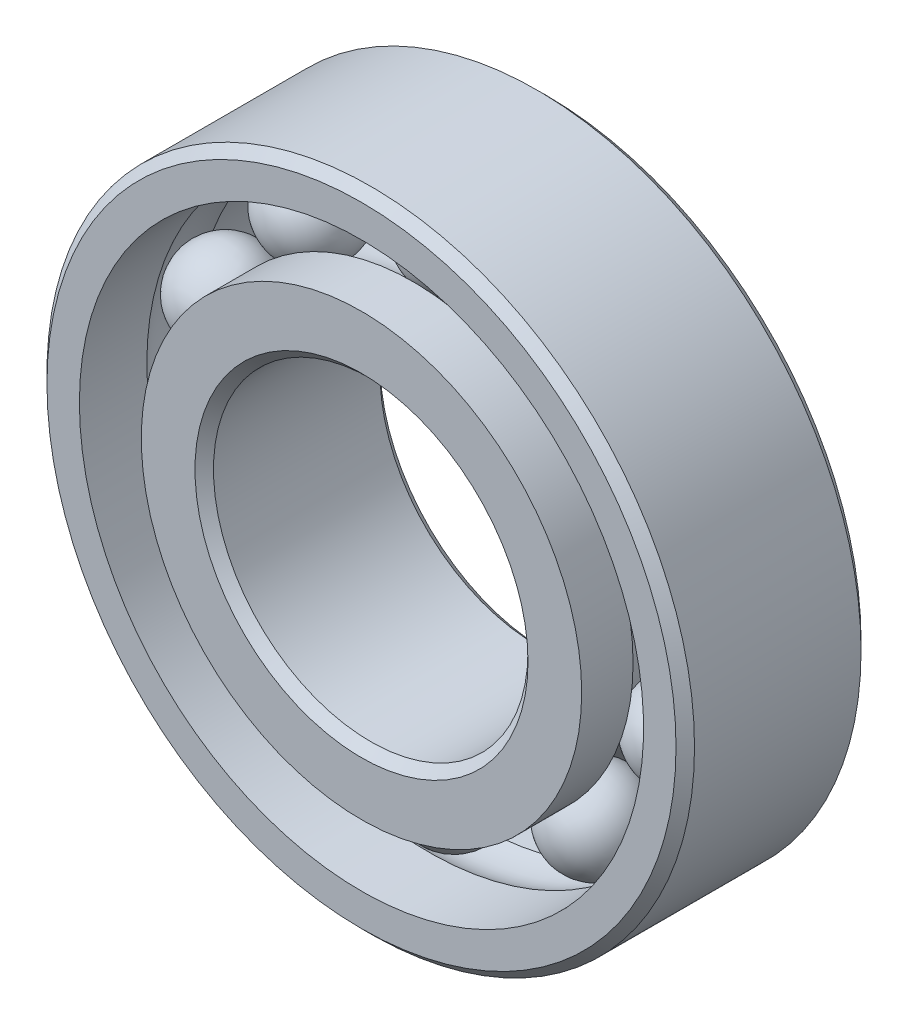
ISO-10303-21;
HEADER;
FILE_DESCRIPTION(('STEP AP214'),'2;1');
FILE_NAME('part.step','',(''),(''),'','','');
FILE_SCHEMA(('AUTOMOTIVE_DESIGN { 1 0 10303 214 1 1 1 1 }'));
ENDSEC;
DATA;
#1=APPLICATION_CONTEXT('core data for automotive mechanical design processes');
#2=APPLICATION_PROTOCOL_DEFINITION('international standard','automotive_design',2000,#1);
#3=PRODUCT_CONTEXT('',#1,'mechanical');
#4=PRODUCT('Part','Part','',(#3));
#5=PRODUCT_RELATED_PRODUCT_CATEGORY('part','',(#4));
#6=PRODUCT_DEFINITION_FORMATION('','',#4);
#7=PRODUCT_DEFINITION_CONTEXT('part definition',#1,'design');
#8=PRODUCT_DEFINITION('design','',#6,#7);
#9=PRODUCT_DEFINITION_SHAPE('','',#8);
#10=(LENGTH_UNIT() NAMED_UNIT(*) SI_UNIT(.MILLI.,.METRE.));
#11=(NAMED_UNIT(*) PLANE_ANGLE_UNIT() SI_UNIT($,.RADIAN.));
#12=(NAMED_UNIT(*) SI_UNIT($,.STERADIAN.) SOLID_ANGLE_UNIT());
#13=UNCERTAINTY_MEASURE_WITH_UNIT(LENGTH_MEASURE(1.E-05),#10,'distance_accuracy_value','');
#14=(GEOMETRIC_REPRESENTATION_CONTEXT(3) GLOBAL_UNCERTAINTY_ASSIGNED_CONTEXT((#13)) GLOBAL_UNIT_ASSIGNED_CONTEXT((#10,
#11,#12)) REPRESENTATION_CONTEXT('',''));
#15=CARTESIAN_POINT('',(0.,0.,0.));
#16=DIRECTION('',(0.,0.,1.));
#17=DIRECTION('',(1.,0.,0.));
#18=AXIS2_PLACEMENT_3D('',#15,#16,#17);
#19=CARTESIAN_POINT('',(0.,17.,-5.00000000000001));
#20=DIRECTION('',(0.,0.,-1.));
#21=DIRECTION('',(-1.,0.,0.));
#22=AXIS2_PLACEMENT_3D('',#19,#20,#21);
#23=PLANE('',#22);
#24=CARTESIAN_POINT('',(0.,0.,-5.00000000000001));
#25=DIRECTION('',(0.,0.,-1.));
#26=DIRECTION('',(-1.,0.,0.));
#27=AXIS2_PLACEMENT_3D('',#24,#25,#26);
#28=CIRCLE('',#27,17.);
#29=CARTESIAN_POINT('',(-17.,0.,-5.00000000000001));
#30=VERTEX_POINT('',#29);
#31=EDGE_CURVE('E11',#30,#30,#28,.T.);
#32=ORIENTED_EDGE('',*,*,#31,.T.);
#33=EDGE_LOOP('',(#32));
#34=FACE_BOUND('',#33,.T.);
#35=CARTESIAN_POINT('',(0.,0.,-5.00000000000001));
#36=DIRECTION('',(0.,0.,-1.));
#37=DIRECTION('',(-1.,0.,0.));
#38=AXIS2_PLACEMENT_3D('',#35,#36,#37);
#39=CIRCLE('',#38,15.2468828709565);
#40=CARTESIAN_POINT('',(-15.2468828709565,0.,-5.00000000000001));
#41=VERTEX_POINT('',#40);
#42=EDGE_CURVE('E61',#41,#41,#39,.T.);
#43=ORIENTED_EDGE('',*,*,#42,.F.);
#44=EDGE_LOOP('',(#43));
#45=FACE_BOUND('',#44,.T.);
#46=ADVANCED_FACE('F39',(#34,#45),#23,.T.);
#47=CARTESIAN_POINT('',(0.,0.,-5.00000000000001));
#48=DIRECTION('',(0.,0.,-1.));
#49=DIRECTION('',(-1.,0.,0.));
#50=AXIS2_PLACEMENT_3D('',#47,#48,#49);
#51=CYLINDRICAL_SURFACE('',#50,17.);
#52=CARTESIAN_POINT('',(0.,0.,5.));
#53=DIRECTION('',(0.,0.,-1.));
#54=DIRECTION('',(-1.,0.,0.));
#55=AXIS2_PLACEMENT_3D('',#52,#53,#54);
#56=CIRCLE('',#55,17.);
#57=CARTESIAN_POINT('',(-17.,0.,5.));
#58=VERTEX_POINT('',#57);
#59=EDGE_CURVE('E45',#58,#58,#56,.T.);
#60=ORIENTED_EDGE('',*,*,#59,.T.);
#61=EDGE_LOOP('',(#60));
#62=FACE_BOUND('',#61,.T.);
#63=ORIENTED_EDGE('',*,*,#31,.F.);
#64=EDGE_LOOP('',(#63));
#65=FACE_BOUND('',#64,.T.);
#66=ADVANCED_FACE('F69',(#62,#65),#51,.T.);
#67=CARTESIAN_POINT('',(0.,17.,5.));
#68=DIRECTION('',(0.,0.,1.));
#69=DIRECTION('',(1.,0.,0.));
#70=AXIS2_PLACEMENT_3D('',#67,#68,#69);
#71=PLANE('',#70);
#72=CARTESIAN_POINT('',(0.,0.,5.));
#73=DIRECTION('',(0.,0.,-1.));
#74=DIRECTION('',(-1.,0.,0.));
#75=AXIS2_PLACEMENT_3D('',#72,#73,#74);
#76=CIRCLE('',#75,15.2468828709565);
#77=CARTESIAN_POINT('',(-15.2468828709565,0.,5.));
#78=VERTEX_POINT('',#77);
#79=EDGE_CURVE('E49',#78,#78,#76,.T.);
#80=ORIENTED_EDGE('',*,*,#79,.T.);
#81=EDGE_LOOP('',(#80));
#82=FACE_BOUND('',#81,.T.);
#83=ORIENTED_EDGE('',*,*,#59,.F.);
#84=EDGE_LOOP('',(#83));
#85=FACE_BOUND('',#84,.T.);
#86=ADVANCED_FACE('F73',(#82,#85),#71,.T.);
#87=CARTESIAN_POINT('',(0.,0.,-5.00000000000001));
#88=DIRECTION('',(0.,0.,-1.));
#89=DIRECTION('',(-1.,0.,0.));
#90=AXIS2_PLACEMENT_3D('',#87,#88,#89);
#91=CYLINDRICAL_SURFACE('',#90,15.2468828709565);
#92=CARTESIAN_POINT('',(0.,0.,1.35620686104391));
#93=DIRECTION('',(0.,0.,-1.));
#94=DIRECTION('',(-1.,0.,0.));
#95=AXIS2_PLACEMENT_3D('',#92,#93,#94);
#96=CIRCLE('',#95,15.2468828709565);
#97=CARTESIAN_POINT('',(-15.2468828709565,0.,1.35620686104391));
#98=VERTEX_POINT('',#97);
#99=EDGE_CURVE('E53',#98,#98,#96,.T.);
#100=ORIENTED_EDGE('',*,*,#99,.T.);
#101=EDGE_LOOP('',(#100));
#102=FACE_BOUND('',#101,.T.);
#103=ORIENTED_EDGE('',*,*,#79,.F.);
#104=EDGE_LOOP('',(#103));
#105=FACE_BOUND('',#104,.T.);
#106=ADVANCED_FACE('F77',(#102,#105),#91,.F.);
#107=CARTESIAN_POINT('',(0.,0.,0.0722849467300002));
#108=DIRECTION('',(0.,0.,-1.));
#109=DIRECTION('',(-1.,0.,0.));
#110=AXIS2_PLACEMENT_3D('',#107,#108,#109);
#111=TOROIDAL_SURFACE('',#110,13.1251042496238,2.48);
#112=CARTESIAN_POINT('',(0.,0.,-1.21163696758391));
#113=DIRECTION('',(0.,0.,-1.));
#114=DIRECTION('',(-1.,0.,0.));
#115=AXIS2_PLACEMENT_3D('',#112,#113,#114);
#116=CIRCLE('',#115,15.2468828709565);
#117=CARTESIAN_POINT('',(-15.2468828709565,0.,-1.21163696758391));
#118=VERTEX_POINT('',#117);
#119=EDGE_CURVE('E58',#118,#118,#116,.T.);
#120=ORIENTED_EDGE('',*,*,#119,.T.);
#121=EDGE_LOOP('',(#120));
#122=FACE_BOUND('',#121,.T.);
#123=ORIENTED_EDGE('',*,*,#99,.F.);
#124=EDGE_LOOP('',(#123));
#125=FACE_BOUND('',#124,.T.);
#126=ADVANCED_FACE('F84',(#122,#125),#111,.F.);
#127=CARTESIAN_POINT('',(0.,0.,-5.00000000000001));
#128=DIRECTION('',(0.,0.,-1.));
#129=DIRECTION('',(-1.,0.,0.));
#130=AXIS2_PLACEMENT_3D('',#127,#128,#129);
#131=CYLINDRICAL_SURFACE('',#130,15.2468828709565);
#132=ORIENTED_EDGE('',*,*,#42,.T.);
#133=EDGE_LOOP('',(#132));
#134=FACE_BOUND('',#133,.T.);
#135=ORIENTED_EDGE('',*,*,#119,.F.);
#136=EDGE_LOOP('',(#135));
#137=FACE_BOUND('',#136,.T.);
#138=ADVANCED_FACE('F65',(#134,#137),#131,.F.);
#139=CLOSED_SHELL('',(#46,#66,#86,#106,#126,#138));
#140=MANIFOLD_SOLID_BREP('B2',#139);
#141=CARTESIAN_POINT('',(-7.64120827980202,10.5172209268744,0.));
#142=DIRECTION('',(0.,0.,1.));
#143=DIRECTION('',(-0.587785252292462,0.809016994374955,0.));
#144=AXIS2_PLACEMENT_3D('',#141,#142,#143);
#145=SPHERICAL_SURFACE('',#144,2.47908354641475);
#146=CARTESIAN_POINT('',(-7.64120827980202,10.5172209268744,2.47908354641474));
#147=VERTEX_POINT('',#146);
#148=VERTEX_LOOP('',#147);
#149=FACE_BOUND('',#148,.T.);
#150=ADVANCED_FACE('F136',(#149),#145,.T.);
#151=CLOSED_SHELL('',(#150));
#152=MANIFOLD_SOLID_BREP('B6',#151);
#153=CARTESIAN_POINT('',(-12.363734711837,4.01722092687446,0.));
#154=DIRECTION('',(0.,0.,1.));
#155=DIRECTION('',(-0.95105651629515,0.309016994374958,0.));
#156=AXIS2_PLACEMENT_3D('',#153,#154,#155);
#157=SPHERICAL_SURFACE('',#156,2.47908354641475);
#158=CARTESIAN_POINT('',(-12.363734711837,4.01722092687446,2.47908354641474));
#159=VERTEX_POINT('',#158);
#160=VERTEX_LOOP('',#159);
#161=FACE_BOUND('',#160,.T.);
#162=ADVANCED_FACE('F156',(#161),#157,.T.);
#163=CLOSED_SHELL('',(#162));
#164=MANIFOLD_SOLID_BREP('B35',#163);
#165=CARTESIAN_POINT('',(-12.363734711837,-4.0172209268742,0.));
#166=DIRECTION('',(0.,0.,1.));
#167=DIRECTION('',(-0.951056516295157,-0.309016994374938,0.));
#168=AXIS2_PLACEMENT_3D('',#165,#166,#167);
#169=SPHERICAL_SURFACE('',#168,2.47908354641475);
#170=CARTESIAN_POINT('',(-12.363734711837,-4.0172209268742,2.47908354641474));
#171=VERTEX_POINT('',#170);
#172=VERTEX_LOOP('',#171);
#173=FACE_BOUND('',#172,.T.);
#174=ADVANCED_FACE('F178',(#173),#169,.T.);
#175=CLOSED_SHELL('',(#174));
#176=MANIFOLD_SOLID_BREP('B132',#175);
#177=CARTESIAN_POINT('',(-7.64120827980225,-10.5172209268743,0.));
#178=DIRECTION('',(0.,0.,1.));
#179=DIRECTION('',(-0.58778525229248,-0.809016994374942,0.));
#180=AXIS2_PLACEMENT_3D('',#177,#178,#179);
#181=SPHERICAL_SURFACE('',#180,2.47908354641475);
#182=CARTESIAN_POINT('',(-7.64120827980225,-10.5172209268743,2.47908354641474));
#183=VERTEX_POINT('',#182);
#184=VERTEX_LOOP('',#183);
#185=FACE_BOUND('',#184,.T.);
#186=ADVANCED_FACE('F197',(#185),#181,.T.);
#187=CLOSED_SHELL('',(#186));
#188=MANIFOLD_SOLID_BREP('B152',#187);
#189=CARTESIAN_POINT('',(0.,-13.,0.));
#190=DIRECTION('',(0.,0.,1.));
#191=DIRECTION('',(0.,-1.,0.));
#192=AXIS2_PLACEMENT_3D('',#189,#190,#191);
#193=SPHERICAL_SURFACE('',#192,2.47908354641475);
#194=CARTESIAN_POINT('',(0.,-13.,2.47908354641474));
#195=VERTEX_POINT('',#194);
#196=VERTEX_LOOP('',#195);
#197=FACE_BOUND('',#196,.T.);
#198=ADVANCED_FACE('F217',(#197),#193,.T.);
#199=CLOSED_SHELL('',(#198));
#200=MANIFOLD_SOLID_BREP('B174',#199);
#201=CARTESIAN_POINT('',(7.6412082798021,-10.5172209268744,0.));
#202=DIRECTION('',(0.,0.,1.));
#203=DIRECTION('',(0.587785252292469,-0.809016994374951,0.));
#204=AXIS2_PLACEMENT_3D('',#201,#202,#203);
#205=SPHERICAL_SURFACE('',#204,2.47908354641475);
#206=CARTESIAN_POINT('',(7.6412082798021,-10.5172209268744,2.47908354641474));
#207=VERTEX_POINT('',#206);
#208=VERTEX_LOOP('',#207);
#209=FACE_BOUND('',#208,.T.);
#210=ADVANCED_FACE('F237',(#209),#205,.T.);
#211=CLOSED_SHELL('',(#210));
#212=MANIFOLD_SOLID_BREP('B193',#211);
#213=CARTESIAN_POINT('',(12.363734711837,-4.01722092687437,0.));
#214=DIRECTION('',(0.,0.,1.));
#215=DIRECTION('',(0.951056516295152,-0.309016994374952,0.));
#216=AXIS2_PLACEMENT_3D('',#213,#214,#215);
#217=SPHERICAL_SURFACE('',#216,2.47908354641475);
#218=CARTESIAN_POINT('',(12.363734711837,-4.01722092687437,2.47908354641474));
#219=VERTEX_POINT('',#218);
#220=VERTEX_LOOP('',#219);
#221=FACE_BOUND('',#220,.T.);
#222=ADVANCED_FACE('F257',(#221),#217,.T.);
#223=CLOSED_SHELL('',(#222));
#224=MANIFOLD_SOLID_BREP('B213',#223);
#225=CARTESIAN_POINT('',(12.363734711837,4.01722092687428,0.));
#226=DIRECTION('',(0.,0.,1.));
#227=DIRECTION('',(0.951056516295155,0.309016994374945,0.));
#228=AXIS2_PLACEMENT_3D('',#225,#226,#227);
#229=SPHERICAL_SURFACE('',#228,2.47908354641475);
#230=CARTESIAN_POINT('',(12.363734711837,4.01722092687428,2.47908354641474));
#231=VERTEX_POINT('',#230);
#232=VERTEX_LOOP('',#231);
#233=FACE_BOUND('',#232,.T.);
#234=ADVANCED_FACE('F277',(#233),#229,.T.);
#235=CLOSED_SHELL('',(#234));
#236=MANIFOLD_SOLID_BREP('B233',#235);
#237=CARTESIAN_POINT('',(7.64120827980217,10.5172209268743,0.));
#238=DIRECTION('',(0.,0.,1.));
#239=DIRECTION('',(0.587785252292474,0.809016994374947,0.));
#240=AXIS2_PLACEMENT_3D('',#237,#238,#239);
#241=SPHERICAL_SURFACE('',#240,2.47908354641475);
#242=CARTESIAN_POINT('',(7.64120827980217,10.5172209268743,2.47908354641474));
#243=VERTEX_POINT('',#242);
#244=VERTEX_LOOP('',#243);
#245=FACE_BOUND('',#244,.T.);
#246=ADVANCED_FACE('F297',(#245),#241,.T.);
#247=CLOSED_SHELL('',(#246));
#248=MANIFOLD_SOLID_BREP('B253',#247);
#249=CARTESIAN_POINT('',(0.,13.,0.));
#250=DIRECTION('',(0.,0.,1.));
#251=DIRECTION('',(0.,1.,0.));
#252=AXIS2_PLACEMENT_3D('',#249,#250,#251);
#253=SPHERICAL_SURFACE('',#252,2.47908354641475);
#254=CARTESIAN_POINT('',(0.,13.,2.47908354641474));
#255=VERTEX_POINT('',#254);
#256=VERTEX_LOOP('',#255);
#257=FACE_BOUND('',#256,.T.);
#258=ADVANCED_FACE('F319',(#257),#253,.T.);
#259=CLOSED_SHELL('',(#258));
#260=MANIFOLD_SOLID_BREP('B273',#259);
#261=CARTESIAN_POINT('',(0.,9.,5.));
#262=DIRECTION('',(0.,0.,-1.));
#263=DIRECTION('',(-1.,0.,0.));
#264=AXIS2_PLACEMENT_3D('',#261,#262,#263);
#265=PLANE('',#264);
#266=CARTESIAN_POINT('',(0.,0.,5.00000000000001));
#267=DIRECTION('',(0.,0.,1.));
#268=DIRECTION('',(1.,0.,0.));
#269=AXIS2_PLACEMENT_3D('',#266,#267,#268);
#270=CIRCLE('',#269,9.);
#271=CARTESIAN_POINT('',(9.,0.,5.00000000000001));
#272=VERTEX_POINT('',#271);
#273=EDGE_CURVE('E318',#272,#272,#270,.T.);
#274=ORIENTED_EDGE('',*,*,#273,.F.);
#275=EDGE_LOOP('',(#274));
#276=FACE_BOUND('',#275,.T.);
#277=CARTESIAN_POINT('',(0.,0.,5.));
#278=DIRECTION('',(0.,0.,1.));
#279=DIRECTION('',(1.,0.,0.));
#280=AXIS2_PLACEMENT_3D('',#277,#278,#279);
#281=CIRCLE('',#280,11.9010989010989);
#282=CARTESIAN_POINT('',(11.9010989010989,0.,5.));
#283=VERTEX_POINT('',#282);
#284=EDGE_CURVE('E380',#283,#283,#281,.T.);
#285=ORIENTED_EDGE('',*,*,#284,.T.);
#286=EDGE_LOOP('',(#285));
#287=FACE_BOUND('',#286,.T.);
#288=ADVANCED_FACE('F352',(#276,#287),#265,.F.);
#289=CARTESIAN_POINT('',(0.,0.,5.00000000000001));
#290=DIRECTION('',(0.,0.,1.));
#291=DIRECTION('',(1.,0.,0.));
#292=AXIS2_PLACEMENT_3D('',#289,#290,#291);
#293=CONICAL_SURFACE('',#292,9.,0.785398163397453);
#294=CARTESIAN_POINT('',(0.,0.,4.50000000000001));
#295=DIRECTION('',(0.,0.,1.));
#296=DIRECTION('',(1.,0.,0.));
#297=AXIS2_PLACEMENT_3D('',#294,#295,#296);
#298=CIRCLE('',#297,8.5);
#299=CARTESIAN_POINT('',(8.5,0.,4.50000000000001));
#300=VERTEX_POINT('',#299);
#301=EDGE_CURVE('E358',#300,#300,#298,.T.);
#302=ORIENTED_EDGE('',*,*,#301,.F.);
#303=EDGE_LOOP('',(#302));
#304=FACE_BOUND('',#303,.T.);
#305=ORIENTED_EDGE('',*,*,#273,.T.);
#306=EDGE_LOOP('',(#305));
#307=FACE_BOUND('',#306,.T.);
#308=ADVANCED_FACE('F417',(#304,#307),#293,.F.);
#309=CARTESIAN_POINT('',(0.,0.,5.));
#310=DIRECTION('',(0.,0.,1.));
#311=DIRECTION('',(1.,0.,0.));
#312=AXIS2_PLACEMENT_3D('',#309,#310,#311);
#313=CYLINDRICAL_SURFACE('',#312,8.5);
#314=CARTESIAN_POINT('',(0.,0.,-4.5));
#315=DIRECTION('',(0.,0.,1.));
#316=DIRECTION('',(1.,0.,0.));
#317=AXIS2_PLACEMENT_3D('',#314,#315,#316);
#318=CIRCLE('',#317,8.5);
#319=CARTESIAN_POINT('',(8.5,0.,-4.5));
#320=VERTEX_POINT('',#319);
#321=EDGE_CURVE('E362',#320,#320,#318,.T.);
#322=ORIENTED_EDGE('',*,*,#321,.F.);
#323=EDGE_LOOP('',(#322));
#324=FACE_BOUND('',#323,.T.);
#325=ORIENTED_EDGE('',*,*,#301,.T.);
#326=EDGE_LOOP('',(#325));
#327=FACE_BOUND('',#326,.T.);
#328=ADVANCED_FACE('F412',(#324,#327),#313,.F.);
#329=CARTESIAN_POINT('',(0.,0.,-4.5));
#330=DIRECTION('',(0.,0.,-1.));
#331=DIRECTION('',(-1.,0.,0.));
#332=AXIS2_PLACEMENT_3D('',#329,#330,#331);
#333=CONICAL_SURFACE('',#332,8.5,0.785398163397442);
#334=CARTESIAN_POINT('',(0.,0.,-5.00000000000001));
#335=DIRECTION('',(0.,0.,1.));
#336=DIRECTION('',(1.,0.,0.));
#337=AXIS2_PLACEMENT_3D('',#334,#335,#336);
#338=CIRCLE('',#337,9.);
#339=CARTESIAN_POINT('',(9.,0.,-5.00000000000001));
#340=VERTEX_POINT('',#339);
#341=EDGE_CURVE('E366',#340,#340,#338,.T.);
#342=ORIENTED_EDGE('',*,*,#341,.F.);
#343=EDGE_LOOP('',(#342));
#344=FACE_BOUND('',#343,.T.);
#345=ORIENTED_EDGE('',*,*,#321,.T.);
#346=EDGE_LOOP('',(#345));
#347=FACE_BOUND('',#346,.T.);
#348=ADVANCED_FACE('F406',(#344,#347),#333,.F.);
#349=CARTESIAN_POINT('',(0.,9.,-5.));
#350=DIRECTION('',(0.,0.,1.));
#351=DIRECTION('',(1.,0.,0.));
#352=AXIS2_PLACEMENT_3D('',#349,#350,#351);
#353=PLANE('',#352);
#354=CARTESIAN_POINT('',(0.,0.,-5.));
#355=DIRECTION('',(0.,0.,1.));
#356=DIRECTION('',(1.,0.,0.));
#357=AXIS2_PLACEMENT_3D('',#354,#355,#356);
#358=CIRCLE('',#357,11.9010989010989);
#359=CARTESIAN_POINT('',(11.9010989010989,0.,-5.));
#360=VERTEX_POINT('',#359);
#361=EDGE_CURVE('E371',#360,#360,#358,.T.);
#362=ORIENTED_EDGE('',*,*,#361,.F.);
#363=EDGE_LOOP('',(#362));
#364=FACE_BOUND('',#363,.T.);
#365=ORIENTED_EDGE('',*,*,#341,.T.);
#366=EDGE_LOOP('',(#365));
#367=FACE_BOUND('',#366,.T.);
#368=ADVANCED_FACE('F400',(#364,#367),#353,.F.);
#369=CARTESIAN_POINT('',(0.,0.,5.));
#370=DIRECTION('',(0.,0.,1.));
#371=DIRECTION('',(1.,0.,0.));
#372=AXIS2_PLACEMENT_3D('',#369,#370,#371);
#373=CYLINDRICAL_SURFACE('',#372,11.9010989010989);
#374=CARTESIAN_POINT('',(0.,0.,-2.22222222222222));
#375=DIRECTION('',(0.,0.,1.));
#376=DIRECTION('',(1.,0.,0.));
#377=AXIS2_PLACEMENT_3D('',#374,#375,#376);
#378=CIRCLE('',#377,11.9010989010989);
#379=CARTESIAN_POINT('',(11.9010989010989,0.,-2.22222222222222));
#380=VERTEX_POINT('',#379);
#381=EDGE_CURVE('E374',#380,#380,#378,.T.);
#382=ORIENTED_EDGE('',*,*,#381,.F.);
#383=EDGE_LOOP('',(#382));
#384=FACE_BOUND('',#383,.T.);
#385=ORIENTED_EDGE('',*,*,#361,.T.);
#386=EDGE_LOOP('',(#385));
#387=FACE_BOUND('',#386,.T.);
#388=ADVANCED_FACE('F394',(#384,#387),#373,.T.);
#389=CARTESIAN_POINT('',(0.,0.,0.));
#390=DIRECTION('',(0.,0.,1.));
#391=DIRECTION('',(1.,0.,0.));
#392=AXIS2_PLACEMENT_3D('',#389,#390,#391);
#393=TOROIDAL_SURFACE('',#392,13.,2.47908354641474);
#394=CARTESIAN_POINT('',(0.,0.,2.22222222222222));
#395=DIRECTION('',(0.,0.,1.));
#396=DIRECTION('',(1.,0.,0.));
#397=AXIS2_PLACEMENT_3D('',#394,#395,#396);
#398=CIRCLE('',#397,11.9010989010989);
#399=CARTESIAN_POINT('',(11.9010989010989,0.,2.22222222222222));
#400=VERTEX_POINT('',#399);
#401=EDGE_CURVE('E377',#400,#400,#398,.T.);
#402=ORIENTED_EDGE('',*,*,#401,.F.);
#403=EDGE_LOOP('',(#402));
#404=FACE_BOUND('',#403,.T.);
#405=ORIENTED_EDGE('',*,*,#381,.T.);
#406=EDGE_LOOP('',(#405));
#407=FACE_BOUND('',#406,.T.);
#408=ADVANCED_FACE('F388',(#404,#407),#393,.F.);
#409=CARTESIAN_POINT('',(0.,0.,5.));
#410=DIRECTION('',(0.,0.,1.));
#411=DIRECTION('',(1.,0.,0.));
#412=AXIS2_PLACEMENT_3D('',#409,#410,#411);
#413=CYLINDRICAL_SURFACE('',#412,11.9010989010989);
#414=ORIENTED_EDGE('',*,*,#284,.F.);
#415=EDGE_LOOP('',(#414));
#416=FACE_BOUND('',#415,.T.);
#417=ORIENTED_EDGE('',*,*,#401,.T.);
#418=EDGE_LOOP('',(#417));
#419=FACE_BOUND('',#418,.T.);
#420=ADVANCED_FACE('F385',(#416,#419),#413,.T.);
#421=CLOSED_SHELL('',(#288,#308,#328,#348,#368,#388,#408,#420));
#422=MANIFOLD_SOLID_BREP('B293',#421);
#423=CARTESIAN_POINT('',(0.,0.,4.5));
#424=DIRECTION('',(0.,0.,-1.));
#425=DIRECTION('',(-1.,0.,0.));
#426=AXIS2_PLACEMENT_3D('',#423,#424,#425);
#427=CONICAL_SURFACE('',#426,17.5,0.785398163397446);
#428=CARTESIAN_POINT('',(0.,0.,5.));
#429=DIRECTION('',(0.,0.,1.));
#430=DIRECTION('',(1.,0.,0.));
#431=AXIS2_PLACEMENT_3D('',#428,#429,#430);
#432=CIRCLE('',#431,17.);
#433=CARTESIAN_POINT('',(17.,0.,5.));
#434=VERTEX_POINT('',#433);
#435=EDGE_CURVE('E351',#434,#434,#432,.T.);
#436=ORIENTED_EDGE('',*,*,#435,.F.);
#437=EDGE_LOOP('',(#436));
#438=FACE_BOUND('',#437,.T.);
#439=CARTESIAN_POINT('',(0.,0.,4.5));
#440=DIRECTION('',(0.,0.,1.));
#441=DIRECTION('',(1.,0.,0.));
#442=AXIS2_PLACEMENT_3D('',#439,#440,#441);
#443=CIRCLE('',#442,17.5);
#444=CARTESIAN_POINT('',(17.5,0.,4.5));
#445=VERTEX_POINT('',#444);
#446=EDGE_CURVE('E487',#445,#445,#443,.T.);
#447=ORIENTED_EDGE('',*,*,#446,.T.);
#448=EDGE_LOOP('',(#447));
#449=FACE_BOUND('',#448,.T.);
#450=ADVANCED_FACE('F473',(#438,#449),#427,.T.);
#451=CARTESIAN_POINT('',(0.,0.,5.));
#452=DIRECTION('',(0.,0.,1.));
#453=DIRECTION('',(1.,0.,0.));
#454=AXIS2_PLACEMENT_3D('',#451,#452,#453);
#455=CYLINDRICAL_SURFACE('',#454,17.);
#456=CARTESIAN_POINT('',(0.,0.,-5.00000000000001));
#457=DIRECTION('',(0.,0.,1.));
#458=DIRECTION('',(1.,0.,0.));
#459=AXIS2_PLACEMENT_3D('',#456,#457,#458);
#460=CIRCLE('',#459,17.);
#461=CARTESIAN_POINT('',(17.,0.,-5.00000000000001));
#462=VERTEX_POINT('',#461);
#463=EDGE_CURVE('E479',#462,#462,#460,.T.);
#464=ORIENTED_EDGE('',*,*,#463,.F.);
#465=EDGE_LOOP('',(#464));
#466=FACE_BOUND('',#465,.T.);
#467=ORIENTED_EDGE('',*,*,#435,.T.);
#468=EDGE_LOOP('',(#467));
#469=FACE_BOUND('',#468,.T.);
#470=ADVANCED_FACE('F502',(#466,#469),#455,.F.);
#471=CARTESIAN_POINT('',(0.,0.,-5.00000000000001));
#472=DIRECTION('',(0.,0.,1.));
#473=DIRECTION('',(1.,0.,0.));
#474=AXIS2_PLACEMENT_3D('',#471,#472,#473);
#475=CONICAL_SURFACE('',#474,17.,0.785398163397445);
#476=CARTESIAN_POINT('',(0.,0.,-4.5));
#477=DIRECTION('',(0.,0.,1.));
#478=DIRECTION('',(1.,0.,0.));
#479=AXIS2_PLACEMENT_3D('',#476,#477,#478);
#480=CIRCLE('',#479,17.5);
#481=CARTESIAN_POINT('',(17.5,0.,-4.5));
#482=VERTEX_POINT('',#481);
#483=EDGE_CURVE('E483',#482,#482,#480,.T.);
#484=ORIENTED_EDGE('',*,*,#483,.F.);
#485=EDGE_LOOP('',(#484));
#486=FACE_BOUND('',#485,.T.);
#487=ORIENTED_EDGE('',*,*,#463,.T.);
#488=EDGE_LOOP('',(#487));
#489=FACE_BOUND('',#488,.T.);
#490=ADVANCED_FACE('F497',(#486,#489),#475,.T.);
#491=CARTESIAN_POINT('',(0.,0.,5.));
#492=DIRECTION('',(0.,0.,1.));
#493=DIRECTION('',(1.,0.,0.));
#494=AXIS2_PLACEMENT_3D('',#491,#492,#493);
#495=CYLINDRICAL_SURFACE('',#494,17.5);
#496=ORIENTED_EDGE('',*,*,#446,.F.);
#497=EDGE_LOOP('',(#496));
#498=FACE_BOUND('',#497,.T.);
#499=ORIENTED_EDGE('',*,*,#483,.T.);
#500=EDGE_LOOP('',(#499));
#501=FACE_BOUND('',#500,.T.);
#502=ADVANCED_FACE('F494',(#498,#501),#495,.T.);
#503=CLOSED_SHELL('',(#450,#470,#490,#502));
#504=MANIFOLD_SOLID_BREP('B313',#503);
#505=ADVANCED_BREP_SHAPE_REPRESENTATION('',(#18,#140,#152,#164,#176,#188,#200,#212,#224,#236,
#248,#260,#422,#504),#14);
#506=SHAPE_DEFINITION_REPRESENTATION(#9,#505);
ENDSEC;
END-ISO-10303-21;
